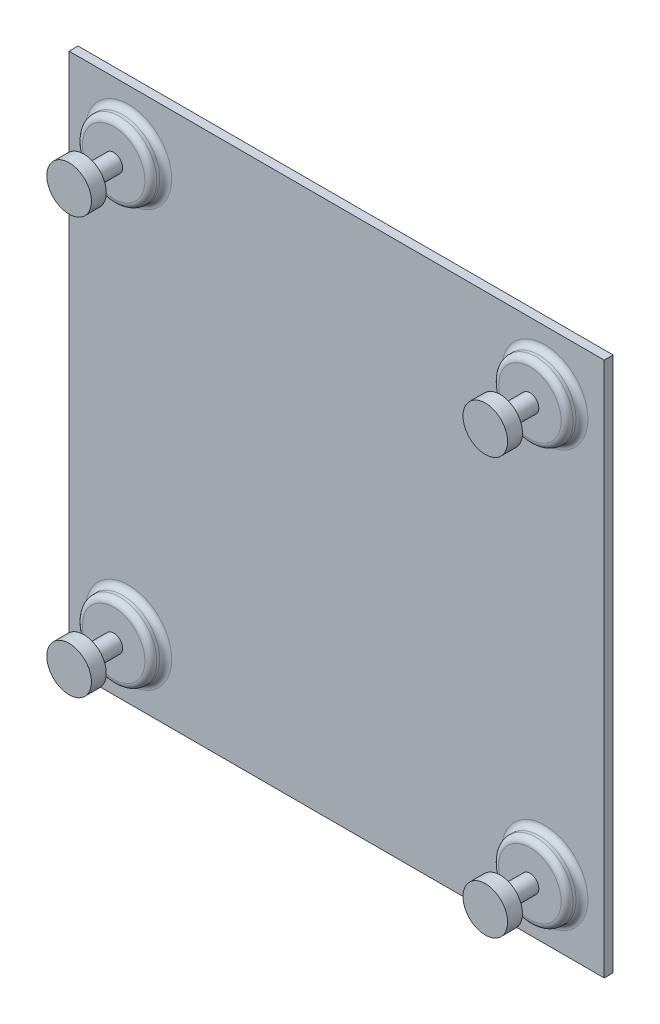
ISO-10303-21;
HEADER;
FILE_DESCRIPTION(('STEP AP214'),'2;1');
FILE_NAME('part.step','',(''),(''),'','','');
FILE_SCHEMA(('AUTOMOTIVE_DESIGN { 1 0 10303 214 1 1 1 1 }'));
ENDSEC;
DATA;
#1=APPLICATION_CONTEXT('core data for automotive mechanical design processes');
#2=APPLICATION_PROTOCOL_DEFINITION('international standard','automotive_design',2000,#1);
#3=PRODUCT_CONTEXT('',#1,'mechanical');
#4=PRODUCT('Part','Part','',(#3));
#5=PRODUCT_RELATED_PRODUCT_CATEGORY('part','',(#4));
#6=PRODUCT_DEFINITION_FORMATION('','',#4);
#7=PRODUCT_DEFINITION_CONTEXT('part definition',#1,'design');
#8=PRODUCT_DEFINITION('design','',#6,#7);
#9=PRODUCT_DEFINITION_SHAPE('','',#8);
#10=(LENGTH_UNIT() NAMED_UNIT(*) SI_UNIT(.MILLI.,.METRE.));
#11=(NAMED_UNIT(*) PLANE_ANGLE_UNIT() SI_UNIT($,.RADIAN.));
#12=(NAMED_UNIT(*) SI_UNIT($,.STERADIAN.) SOLID_ANGLE_UNIT());
#13=UNCERTAINTY_MEASURE_WITH_UNIT(LENGTH_MEASURE(1.E-05),#10,'distance_accuracy_value','');
#14=(GEOMETRIC_REPRESENTATION_CONTEXT(3) GLOBAL_UNCERTAINTY_ASSIGNED_CONTEXT((#13)) GLOBAL_UNIT_ASSIGNED_CONTEXT((#10,
#11,#12)) REPRESENTATION_CONTEXT('',''));
#15=CARTESIAN_POINT('',(0.,0.,0.));
#16=DIRECTION('',(0.,0.,1.));
#17=DIRECTION('',(1.,0.,0.));
#18=AXIS2_PLACEMENT_3D('',#15,#16,#17);
#19=CARTESIAN_POINT('',(114.3,-114.3,3.81));
#20=DIRECTION('',(-1.,0.,0.));
#21=DIRECTION('',(0.,0.,1.));
#22=AXIS2_PLACEMENT_3D('',#19,#20,#21);
#23=PLANE('',#22);
#24=DIRECTION('',(0.,1.,0.));
#25=VECTOR('',#24,1.);
#26=CARTESIAN_POINT('',(114.3,-114.3,0.));
#27=LINE('',#26,#25);
#28=CARTESIAN_POINT('',(114.3,-114.3,0.));
#29=VERTEX_POINT('',#28);
#30=CARTESIAN_POINT('',(114.3,114.3,0.));
#31=VERTEX_POINT('',#30);
#32=EDGE_CURVE('E106',#29,#31,#27,.T.);
#33=ORIENTED_EDGE('',*,*,#32,.T.);
#34=DIRECTION('',(0.,0.,-1.));
#35=VECTOR('',#34,1.);
#36=CARTESIAN_POINT('',(114.3,114.3,3.81));
#37=LINE('',#36,#35);
#38=CARTESIAN_POINT('',(114.3,114.3,3.81));
#39=VERTEX_POINT('',#38);
#40=EDGE_CURVE('E97',#39,#31,#37,.T.);
#41=ORIENTED_EDGE('',*,*,#40,.F.);
#42=DIRECTION('',(0.,1.,0.));
#43=VECTOR('',#42,1.);
#44=CARTESIAN_POINT('',(114.3,-114.3,3.81));
#45=LINE('',#44,#43);
#46=CARTESIAN_POINT('',(114.3,-114.3,3.81));
#47=VERTEX_POINT('',#46);
#48=EDGE_CURVE('E91',#47,#39,#45,.T.);
#49=ORIENTED_EDGE('',*,*,#48,.F.);
#50=DIRECTION('',(0.,0.,-1.));
#51=VECTOR('',#50,1.);
#52=CARTESIAN_POINT('',(114.3,-114.3,3.81));
#53=LINE('',#52,#51);
#54=EDGE_CURVE('E102',#47,#29,#53,.T.);
#55=ORIENTED_EDGE('',*,*,#54,.T.);
#56=EDGE_LOOP('',(#33,#41,#49,#55));
#57=FACE_BOUND('',#56,.T.);
#58=ADVANCED_FACE('F38',(#57),#23,.F.);
#59=CARTESIAN_POINT('',(-114.3,114.3,3.81));
#60=DIRECTION('',(0.,-1.,0.));
#61=DIRECTION('',(0.,0.,-1.));
#62=AXIS2_PLACEMENT_3D('',#59,#60,#61);
#63=PLANE('',#62);
#64=DIRECTION('',(-1.,0.,0.));
#65=VECTOR('',#64,1.);
#66=CARTESIAN_POINT('',(-114.3,114.3,0.));
#67=LINE('',#66,#65);
#68=CARTESIAN_POINT('',(-114.3,114.3,0.));
#69=VERTEX_POINT('',#68);
#70=EDGE_CURVE('E96',#31,#69,#67,.T.);
#71=ORIENTED_EDGE('',*,*,#70,.T.);
#72=DIRECTION('',(0.,0.,-1.));
#73=VECTOR('',#72,1.);
#74=CARTESIAN_POINT('',(-114.3,114.3,3.81));
#75=LINE('',#74,#73);
#76=CARTESIAN_POINT('',(-114.3,114.3,3.81));
#77=VERTEX_POINT('',#76);
#78=EDGE_CURVE('E94',#77,#69,#75,.T.);
#79=ORIENTED_EDGE('',*,*,#78,.F.);
#80=DIRECTION('',(-1.,0.,0.));
#81=VECTOR('',#80,1.);
#82=CARTESIAN_POINT('',(-114.3,114.3,3.81));
#83=LINE('',#82,#81);
#84=EDGE_CURVE('E86',#39,#77,#83,.T.);
#85=ORIENTED_EDGE('',*,*,#84,.F.);
#86=ORIENTED_EDGE('',*,*,#40,.T.);
#87=EDGE_LOOP('',(#71,#79,#85,#86));
#88=FACE_BOUND('',#87,.T.);
#89=ADVANCED_FACE('F95',(#88),#63,.F.);
#90=CARTESIAN_POINT('',(-114.3,-114.3,3.81));
#91=DIRECTION('',(1.,0.,0.));
#92=DIRECTION('',(0.,0.,-1.));
#93=AXIS2_PLACEMENT_3D('',#90,#91,#92);
#94=PLANE('',#93);
#95=DIRECTION('',(0.,-1.,0.));
#96=VECTOR('',#95,1.);
#97=CARTESIAN_POINT('',(-114.3,-114.3,0.));
#98=LINE('',#97,#96);
#99=CARTESIAN_POINT('',(-114.3,-114.3,0.));
#100=VERTEX_POINT('',#99);
#101=EDGE_CURVE('E72',#69,#100,#98,.T.);
#102=ORIENTED_EDGE('',*,*,#101,.T.);
#103=DIRECTION('',(0.,0.,-1.));
#104=VECTOR('',#103,1.);
#105=CARTESIAN_POINT('',(-114.3,-114.3,3.81));
#106=LINE('',#105,#104);
#107=CARTESIAN_POINT('',(-114.3,-114.3,3.81));
#108=VERTEX_POINT('',#107);
#109=EDGE_CURVE('E98',#108,#100,#106,.T.);
#110=ORIENTED_EDGE('',*,*,#109,.F.);
#111=DIRECTION('',(0.,-1.,0.));
#112=VECTOR('',#111,1.);
#113=CARTESIAN_POINT('',(-114.3,-114.3,3.81));
#114=LINE('',#113,#112);
#115=EDGE_CURVE('E89',#77,#108,#114,.T.);
#116=ORIENTED_EDGE('',*,*,#115,.F.);
#117=ORIENTED_EDGE('',*,*,#78,.T.);
#118=EDGE_LOOP('',(#102,#110,#116,#117));
#119=FACE_BOUND('',#118,.T.);
#120=ADVANCED_FACE('F100',(#119),#94,.F.);
#121=CARTESIAN_POINT('',(-114.3,-114.3,3.81));
#122=DIRECTION('',(0.,1.,0.));
#123=DIRECTION('',(0.,0.,1.));
#124=AXIS2_PLACEMENT_3D('',#121,#122,#123);
#125=PLANE('',#124);
#126=DIRECTION('',(1.,0.,0.));
#127=VECTOR('',#126,1.);
#128=CARTESIAN_POINT('',(-114.3,-114.3,0.));
#129=LINE('',#128,#127);
#130=EDGE_CURVE('E78',#100,#29,#129,.T.);
#131=ORIENTED_EDGE('',*,*,#130,.T.);
#132=ORIENTED_EDGE('',*,*,#54,.F.);
#133=DIRECTION('',(1.,0.,0.));
#134=VECTOR('',#133,1.);
#135=CARTESIAN_POINT('',(-114.3,-114.3,3.81));
#136=LINE('',#135,#134);
#137=EDGE_CURVE('E55',#108,#47,#136,.T.);
#138=ORIENTED_EDGE('',*,*,#137,.F.);
#139=ORIENTED_EDGE('',*,*,#109,.T.);
#140=EDGE_LOOP('',(#131,#132,#138,#139));
#141=FACE_BOUND('',#140,.T.);
#142=ADVANCED_FACE('F276',(#141),#125,.F.);
#143=CARTESIAN_POINT('',(0.,0.,3.81));
#144=DIRECTION('',(0.,0.,-1.));
#145=DIRECTION('',(-1.,0.,0.));
#146=AXIS2_PLACEMENT_3D('',#143,#144,#145);
#147=PLANE('',#146);
#148=CARTESIAN_POINT('',(88.9,-88.9,3.81));
#149=DIRECTION('',(0.,0.,-1.));
#150=DIRECTION('',(-1.,0.,0.));
#151=AXIS2_PLACEMENT_3D('',#148,#149,#150);
#152=CIRCLE('',#151,18.415);
#153=CARTESIAN_POINT('',(70.485,-88.9,3.81));
#154=VERTEX_POINT('',#153);
#155=EDGE_CURVE('E154',#154,#154,#152,.T.);
#156=ORIENTED_EDGE('',*,*,#155,.T.);
#157=EDGE_LOOP('',(#156));
#158=FACE_BOUND('',#157,.T.);
#159=CARTESIAN_POINT('',(88.9,88.9,3.81));
#160=DIRECTION('',(0.,0.,-1.));
#161=DIRECTION('',(-1.,0.,0.));
#162=AXIS2_PLACEMENT_3D('',#159,#160,#161);
#163=CIRCLE('',#162,18.415);
#164=CARTESIAN_POINT('',(70.485,88.9,3.81));
#165=VERTEX_POINT('',#164);
#166=EDGE_CURVE('E151',#165,#165,#163,.T.);
#167=ORIENTED_EDGE('',*,*,#166,.T.);
#168=EDGE_LOOP('',(#167));
#169=FACE_BOUND('',#168,.T.);
#170=CARTESIAN_POINT('',(-88.9,88.9,3.81));
#171=DIRECTION('',(0.,0.,-1.));
#172=DIRECTION('',(-1.,0.,0.));
#173=AXIS2_PLACEMENT_3D('',#170,#171,#172);
#174=CIRCLE('',#173,18.415);
#175=CARTESIAN_POINT('',(-107.315,88.9,3.81));
#176=VERTEX_POINT('',#175);
#177=EDGE_CURVE('E148',#176,#176,#174,.T.);
#178=ORIENTED_EDGE('',*,*,#177,.T.);
#179=EDGE_LOOP('',(#178));
#180=FACE_BOUND('',#179,.T.);
#181=CARTESIAN_POINT('',(-88.9,-88.9,3.81));
#182=DIRECTION('',(0.,0.,-1.));
#183=DIRECTION('',(-1.,0.,0.));
#184=AXIS2_PLACEMENT_3D('',#181,#182,#183);
#185=CIRCLE('',#184,18.415);
#186=CARTESIAN_POINT('',(-107.315,-88.9,3.81));
#187=VERTEX_POINT('',#186);
#188=EDGE_CURVE('E145',#187,#187,#185,.T.);
#189=ORIENTED_EDGE('',*,*,#188,.T.);
#190=EDGE_LOOP('',(#189));
#191=FACE_BOUND('',#190,.T.);
#192=ORIENTED_EDGE('',*,*,#48,.T.);
#193=ORIENTED_EDGE('',*,*,#84,.T.);
#194=ORIENTED_EDGE('',*,*,#115,.T.);
#195=ORIENTED_EDGE('',*,*,#137,.T.);
#196=EDGE_LOOP('',(#192,#193,#194,#195));
#197=FACE_BOUND('',#196,.T.);
#198=ADVANCED_FACE('F87',(#158,#169,#180,#191,#197),#147,.F.);
#199=CARTESIAN_POINT('',(0.,0.,0.));
#200=DIRECTION('',(0.,0.,-1.));
#201=DIRECTION('',(-1.,0.,0.));
#202=AXIS2_PLACEMENT_3D('',#199,#200,#201);
#203=PLANE('',#202);
#204=ORIENTED_EDGE('',*,*,#32,.F.);
#205=ORIENTED_EDGE('',*,*,#130,.F.);
#206=ORIENTED_EDGE('',*,*,#101,.F.);
#207=ORIENTED_EDGE('',*,*,#70,.F.);
#208=EDGE_LOOP('',(#204,#205,#206,#207));
#209=FACE_BOUND('',#208,.T.);
#210=ADVANCED_FACE('F216',(#209),#203,.T.);
#211=CARTESIAN_POINT('',(88.9,-88.9,10.16));
#212=DIRECTION('',(0.,0.,-1.));
#213=DIRECTION('',(-1.,0.,0.));
#214=AXIS2_PLACEMENT_3D('',#211,#212,#213);
#215=CYLINDRICAL_SURFACE('',#214,15.875);
#216=CARTESIAN_POINT('',(88.9,-88.9,6.35));
#217=DIRECTION('',(0.,0.,-1.));
#218=DIRECTION('',(-1.,0.,0.));
#219=AXIS2_PLACEMENT_3D('',#216,#217,#218);
#220=CIRCLE('',#219,15.875);
#221=CARTESIAN_POINT('',(73.025,-88.9,6.35));
#222=VERTEX_POINT('',#221);
#223=EDGE_CURVE('E142',#222,#222,#220,.F.);
#224=ORIENTED_EDGE('',*,*,#223,.T.);
#225=EDGE_LOOP('',(#224));
#226=FACE_BOUND('',#225,.T.);
#227=CARTESIAN_POINT('',(88.9,-88.9,7.62));
#228=DIRECTION('',(0.,0.,1.));
#229=DIRECTION('',(1.,0.,0.));
#230=AXIS2_PLACEMENT_3D('',#227,#228,#229);
#231=CIRCLE('',#230,15.875);
#232=CARTESIAN_POINT('',(104.775,-88.9,7.62));
#233=VERTEX_POINT('',#232);
#234=EDGE_CURVE('E120',#233,#233,#231,.F.);
#235=ORIENTED_EDGE('',*,*,#234,.T.);
#236=EDGE_LOOP('',(#235));
#237=FACE_BOUND('',#236,.T.);
#238=ADVANCED_FACE('F212',(#226,#237),#215,.T.);
#239=CARTESIAN_POINT('',(88.9,-88.9,10.16));
#240=DIRECTION('',(0.,0.,1.));
#241=DIRECTION('',(1.,0.,0.));
#242=AXIS2_PLACEMENT_3D('',#239,#240,#241);
#243=PLANE('',#242);
#244=CARTESIAN_POINT('',(88.9,-88.9,10.16));
#245=DIRECTION('',(0.,0.,1.));
#246=DIRECTION('',(1.,0.,0.));
#247=AXIS2_PLACEMENT_3D('',#244,#245,#246);
#248=CIRCLE('',#247,13.335);
#249=CARTESIAN_POINT('',(102.235,-88.9,10.16));
#250=VERTEX_POINT('',#249);
#251=EDGE_CURVE('E117',#250,#250,#248,.T.);
#252=ORIENTED_EDGE('',*,*,#251,.T.);
#253=EDGE_LOOP('',(#252));
#254=FACE_BOUND('',#253,.T.);
#255=CARTESIAN_POINT('',(88.9,-88.9,10.16));
#256=DIRECTION('',(0.,0.,1.));
#257=DIRECTION('',(1.,0.,0.));
#258=AXIS2_PLACEMENT_3D('',#255,#256,#257);
#259=CIRCLE('',#258,3.81);
#260=CARTESIAN_POINT('',(92.71,-88.9,10.16));
#261=VERTEX_POINT('',#260);
#262=EDGE_CURVE('E228',#261,#261,#259,.T.);
#263=ORIENTED_EDGE('',*,*,#262,.F.);
#264=EDGE_LOOP('',(#263));
#265=FACE_BOUND('',#264,.T.);
#266=ADVANCED_FACE('F215',(#254,#265),#243,.T.);
#267=CARTESIAN_POINT('',(88.9,88.9,10.16));
#268=DIRECTION('',(0.,0.,-1.));
#269=DIRECTION('',(-1.,0.,0.));
#270=AXIS2_PLACEMENT_3D('',#267,#268,#269);
#271=CYLINDRICAL_SURFACE('',#270,15.875);
#272=CARTESIAN_POINT('',(88.9,88.9,6.35));
#273=DIRECTION('',(0.,0.,-1.));
#274=DIRECTION('',(-1.,0.,0.));
#275=AXIS2_PLACEMENT_3D('',#272,#273,#274);
#276=CIRCLE('',#275,15.875);
#277=CARTESIAN_POINT('',(73.025,88.9,6.35));
#278=VERTEX_POINT('',#277);
#279=EDGE_CURVE('E157',#278,#278,#276,.F.);
#280=ORIENTED_EDGE('',*,*,#279,.T.);
#281=EDGE_LOOP('',(#280));
#282=FACE_BOUND('',#281,.T.);
#283=CARTESIAN_POINT('',(88.9,88.9,7.62));
#284=DIRECTION('',(0.,0.,-1.));
#285=DIRECTION('',(-1.,0.,0.));
#286=AXIS2_PLACEMENT_3D('',#283,#284,#285);
#287=CIRCLE('',#286,15.875);
#288=CARTESIAN_POINT('',(73.025,88.9,7.62));
#289=VERTEX_POINT('',#288);
#290=EDGE_CURVE('E127',#289,#289,#287,.T.);
#291=ORIENTED_EDGE('',*,*,#290,.T.);
#292=EDGE_LOOP('',(#291));
#293=FACE_BOUND('',#292,.T.);
#294=ADVANCED_FACE('F224',(#282,#293),#271,.T.);
#295=CARTESIAN_POINT('',(88.9,88.9,10.16));
#296=DIRECTION('',(0.,0.,-1.));
#297=DIRECTION('',(-1.,0.,0.));
#298=AXIS2_PLACEMENT_3D('',#295,#296,#297);
#299=PLANE('',#298);
#300=CARTESIAN_POINT('',(88.9,88.9,10.16));
#301=DIRECTION('',(0.,0.,-1.));
#302=DIRECTION('',(-1.,0.,0.));
#303=AXIS2_PLACEMENT_3D('',#300,#301,#302);
#304=CIRCLE('',#303,13.335);
#305=CARTESIAN_POINT('',(75.565,88.9,10.16));
#306=VERTEX_POINT('',#305);
#307=EDGE_CURVE('E124',#306,#306,#304,.F.);
#308=ORIENTED_EDGE('',*,*,#307,.T.);
#309=EDGE_LOOP('',(#308));
#310=FACE_BOUND('',#309,.T.);
#311=CARTESIAN_POINT('',(88.9,88.9,10.16));
#312=DIRECTION('',(0.,0.,1.));
#313=DIRECTION('',(1.,0.,0.));
#314=AXIS2_PLACEMENT_3D('',#311,#312,#313);
#315=CIRCLE('',#314,3.81);
#316=CARTESIAN_POINT('',(92.71,88.9,10.16));
#317=VERTEX_POINT('',#316);
#318=EDGE_CURVE('E121',#317,#317,#315,.T.);
#319=ORIENTED_EDGE('',*,*,#318,.F.);
#320=EDGE_LOOP('',(#319));
#321=FACE_BOUND('',#320,.T.);
#322=ADVANCED_FACE('F263',(#310,#321),#299,.F.);
#323=CARTESIAN_POINT('',(-88.9,-88.9,10.16));
#324=DIRECTION('',(0.,0.,-1.));
#325=DIRECTION('',(-1.,0.,0.));
#326=AXIS2_PLACEMENT_3D('',#323,#324,#325);
#327=CYLINDRICAL_SURFACE('',#326,15.875);
#328=CARTESIAN_POINT('',(-88.9,-88.9,6.35));
#329=DIRECTION('',(0.,0.,-1.));
#330=DIRECTION('',(-1.,0.,0.));
#331=AXIS2_PLACEMENT_3D('',#328,#329,#330);
#332=CIRCLE('',#331,15.875);
#333=CARTESIAN_POINT('',(-104.775,-88.9,6.35));
#334=VERTEX_POINT('',#333);
#335=EDGE_CURVE('E11',#334,#334,#332,.F.);
#336=ORIENTED_EDGE('',*,*,#335,.T.);
#337=EDGE_LOOP('',(#336));
#338=FACE_BOUND('',#337,.T.);
#339=CARTESIAN_POINT('',(-88.9,-88.9,7.62));
#340=DIRECTION('',(0.,0.,-1.));
#341=DIRECTION('',(-1.,0.,0.));
#342=AXIS2_PLACEMENT_3D('',#339,#340,#341);
#343=CIRCLE('',#342,15.875);
#344=CARTESIAN_POINT('',(-104.775,-88.9,7.62));
#345=VERTEX_POINT('',#344);
#346=EDGE_CURVE('E139',#345,#345,#343,.T.);
#347=ORIENTED_EDGE('',*,*,#346,.T.);
#348=EDGE_LOOP('',(#347));
#349=FACE_BOUND('',#348,.T.);
#350=ADVANCED_FACE('F254',(#338,#349),#327,.T.);
#351=CARTESIAN_POINT('',(-88.9,-88.9,10.16));
#352=DIRECTION('',(0.,0.,-1.));
#353=DIRECTION('',(-1.,0.,0.));
#354=AXIS2_PLACEMENT_3D('',#351,#352,#353);
#355=PLANE('',#354);
#356=CARTESIAN_POINT('',(-88.9,-88.9,10.16));
#357=DIRECTION('',(0.,0.,-1.));
#358=DIRECTION('',(-1.,0.,0.));
#359=AXIS2_PLACEMENT_3D('',#356,#357,#358);
#360=CIRCLE('',#359,13.335);
#361=CARTESIAN_POINT('',(-102.235,-88.9,10.16));
#362=VERTEX_POINT('',#361);
#363=EDGE_CURVE('E136',#362,#362,#360,.F.);
#364=ORIENTED_EDGE('',*,*,#363,.T.);
#365=EDGE_LOOP('',(#364));
#366=FACE_BOUND('',#365,.T.);
#367=CARTESIAN_POINT('',(-88.9,-88.9,10.16));
#368=DIRECTION('',(0.,0.,1.));
#369=DIRECTION('',(1.,0.,0.));
#370=AXIS2_PLACEMENT_3D('',#367,#368,#369);
#371=CIRCLE('',#370,3.81);
#372=CARTESIAN_POINT('',(-85.09,-88.9,10.16));
#373=VERTEX_POINT('',#372);
#374=EDGE_CURVE('E116',#373,#373,#371,.T.);
#375=ORIENTED_EDGE('',*,*,#374,.F.);
#376=EDGE_LOOP('',(#375));
#377=FACE_BOUND('',#376,.T.);
#378=ADVANCED_FACE('F252',(#366,#377),#355,.F.);
#379=CARTESIAN_POINT('',(-88.9,88.9,10.16));
#380=DIRECTION('',(0.,0.,-1.));
#381=DIRECTION('',(-1.,0.,0.));
#382=AXIS2_PLACEMENT_3D('',#379,#380,#381);
#383=CYLINDRICAL_SURFACE('',#382,15.875);
#384=CARTESIAN_POINT('',(-88.9,88.9,6.35));
#385=DIRECTION('',(0.,0.,-1.));
#386=DIRECTION('',(-1.,0.,0.));
#387=AXIS2_PLACEMENT_3D('',#384,#385,#386);
#388=CIRCLE('',#387,15.875);
#389=CARTESIAN_POINT('',(-104.775,88.9,6.35));
#390=VERTEX_POINT('',#389);
#391=EDGE_CURVE('E47',#390,#390,#388,.F.);
#392=ORIENTED_EDGE('',*,*,#391,.T.);
#393=EDGE_LOOP('',(#392));
#394=FACE_BOUND('',#393,.T.);
#395=CARTESIAN_POINT('',(-88.9,88.9,7.62));
#396=DIRECTION('',(0.,0.,1.));
#397=DIRECTION('',(1.,0.,0.));
#398=AXIS2_PLACEMENT_3D('',#395,#396,#397);
#399=CIRCLE('',#398,15.875);
#400=CARTESIAN_POINT('',(-73.025,88.9,7.62));
#401=VERTEX_POINT('',#400);
#402=EDGE_CURVE('E133',#401,#401,#399,.F.);
#403=ORIENTED_EDGE('',*,*,#402,.T.);
#404=EDGE_LOOP('',(#403));
#405=FACE_BOUND('',#404,.T.);
#406=ADVANCED_FACE('F162',(#394,#405),#383,.T.);
#407=CARTESIAN_POINT('',(-88.9,88.9,10.16));
#408=DIRECTION('',(0.,0.,1.));
#409=DIRECTION('',(1.,0.,0.));
#410=AXIS2_PLACEMENT_3D('',#407,#408,#409);
#411=PLANE('',#410);
#412=CARTESIAN_POINT('',(-88.9,88.9,10.16));
#413=DIRECTION('',(0.,0.,1.));
#414=DIRECTION('',(1.,0.,0.));
#415=AXIS2_PLACEMENT_3D('',#412,#413,#414);
#416=CIRCLE('',#415,13.335);
#417=CARTESIAN_POINT('',(-75.565,88.9,10.16));
#418=VERTEX_POINT('',#417);
#419=EDGE_CURVE('E130',#418,#418,#416,.T.);
#420=ORIENTED_EDGE('',*,*,#419,.T.);
#421=EDGE_LOOP('',(#420));
#422=FACE_BOUND('',#421,.T.);
#423=CARTESIAN_POINT('',(-88.9,88.9,10.16));
#424=DIRECTION('',(0.,0.,1.));
#425=DIRECTION('',(1.,0.,0.));
#426=AXIS2_PLACEMENT_3D('',#423,#424,#425);
#427=CIRCLE('',#426,3.81);
#428=CARTESIAN_POINT('',(-85.09,88.9,10.16));
#429=VERTEX_POINT('',#428);
#430=EDGE_CURVE('E230',#429,#429,#427,.T.);
#431=ORIENTED_EDGE('',*,*,#430,.F.);
#432=EDGE_LOOP('',(#431));
#433=FACE_BOUND('',#432,.T.);
#434=ADVANCED_FACE('F261',(#422,#433),#411,.T.);
#435=CARTESIAN_POINT('',(-88.9,-88.9,22.86));
#436=DIRECTION('',(0.,0.,-1.));
#437=DIRECTION('',(-1.,0.,0.));
#438=AXIS2_PLACEMENT_3D('',#435,#436,#437);
#439=CYLINDRICAL_SURFACE('',#438,3.81);
#440=CARTESIAN_POINT('',(-88.9,-88.9,22.86));
#441=DIRECTION('',(0.,0.,1.));
#442=DIRECTION('',(1.,0.,0.));
#443=AXIS2_PLACEMENT_3D('',#440,#441,#442);
#444=CIRCLE('',#443,3.81);
#445=CARTESIAN_POINT('',(-85.09,-88.9,22.86));
#446=VERTEX_POINT('',#445);
#447=EDGE_CURVE('E109',#446,#446,#444,.T.);
#448=ORIENTED_EDGE('',*,*,#447,.F.);
#449=EDGE_LOOP('',(#448));
#450=FACE_BOUND('',#449,.T.);
#451=ORIENTED_EDGE('',*,*,#374,.T.);
#452=EDGE_LOOP('',(#451));
#453=FACE_BOUND('',#452,.T.);
#454=ADVANCED_FACE('F250',(#450,#453),#439,.T.);
#455=CARTESIAN_POINT('',(-88.9,88.9,22.86));
#456=DIRECTION('',(0.,0.,-1.));
#457=DIRECTION('',(-1.,0.,0.));
#458=AXIS2_PLACEMENT_3D('',#455,#456,#457);
#459=CYLINDRICAL_SURFACE('',#458,3.81);
#460=CARTESIAN_POINT('',(-88.9,88.9,22.86));
#461=DIRECTION('',(0.,0.,1.));
#462=DIRECTION('',(1.,0.,0.));
#463=AXIS2_PLACEMENT_3D('',#460,#461,#462);
#464=CIRCLE('',#463,3.81);
#465=CARTESIAN_POINT('',(-85.09,88.9,22.86));
#466=VERTEX_POINT('',#465);
#467=EDGE_CURVE('E241',#466,#466,#464,.T.);
#468=ORIENTED_EDGE('',*,*,#467,.F.);
#469=EDGE_LOOP('',(#468));
#470=FACE_BOUND('',#469,.T.);
#471=ORIENTED_EDGE('',*,*,#430,.T.);
#472=EDGE_LOOP('',(#471));
#473=FACE_BOUND('',#472,.T.);
#474=ADVANCED_FACE('F522',(#470,#473),#459,.T.);
#475=CARTESIAN_POINT('',(88.9,-88.9,22.86));
#476=DIRECTION('',(0.,0.,-1.));
#477=DIRECTION('',(-1.,0.,0.));
#478=AXIS2_PLACEMENT_3D('',#475,#476,#477);
#479=CYLINDRICAL_SURFACE('',#478,3.81);
#480=CARTESIAN_POINT('',(88.9,-88.9,22.86));
#481=DIRECTION('',(0.,0.,1.));
#482=DIRECTION('',(1.,0.,0.));
#483=AXIS2_PLACEMENT_3D('',#480,#481,#482);
#484=CIRCLE('',#483,3.81);
#485=CARTESIAN_POINT('',(92.71,-88.9,22.86));
#486=VERTEX_POINT('',#485);
#487=EDGE_CURVE('E239',#486,#486,#484,.T.);
#488=ORIENTED_EDGE('',*,*,#487,.F.);
#489=EDGE_LOOP('',(#488));
#490=FACE_BOUND('',#489,.T.);
#491=ORIENTED_EDGE('',*,*,#262,.T.);
#492=EDGE_LOOP('',(#491));
#493=FACE_BOUND('',#492,.T.);
#494=ADVANCED_FACE('F512',(#490,#493),#479,.T.);
#495=CARTESIAN_POINT('',(88.9,88.9,22.86));
#496=DIRECTION('',(0.,0.,-1.));
#497=DIRECTION('',(-1.,0.,0.));
#498=AXIS2_PLACEMENT_3D('',#495,#496,#497);
#499=CYLINDRICAL_SURFACE('',#498,3.81);
#500=CARTESIAN_POINT('',(88.9,88.9,22.86));
#501=DIRECTION('',(0.,0.,1.));
#502=DIRECTION('',(1.,0.,0.));
#503=AXIS2_PLACEMENT_3D('',#500,#501,#502);
#504=CIRCLE('',#503,3.81);
#505=CARTESIAN_POINT('',(92.71,88.9,22.86));
#506=VERTEX_POINT('',#505);
#507=EDGE_CURVE('E238',#506,#506,#504,.T.);
#508=ORIENTED_EDGE('',*,*,#507,.F.);
#509=EDGE_LOOP('',(#508));
#510=FACE_BOUND('',#509,.T.);
#511=ORIENTED_EDGE('',*,*,#318,.T.);
#512=EDGE_LOOP('',(#511));
#513=FACE_BOUND('',#512,.T.);
#514=ADVANCED_FACE('F502',(#510,#513),#499,.T.);
#515=CARTESIAN_POINT('',(-88.9,-88.9,29.21));
#516=DIRECTION('',(0.,0.,-1.));
#517=DIRECTION('',(-1.,0.,0.));
#518=AXIS2_PLACEMENT_3D('',#515,#516,#517);
#519=CYLINDRICAL_SURFACE('',#518,9.52500000000001);
#520=CARTESIAN_POINT('',(-88.9,-88.9,29.21));
#521=DIRECTION('',(0.,0.,1.));
#522=DIRECTION('',(1.,0.,0.));
#523=AXIS2_PLACEMENT_3D('',#520,#521,#522);
#524=CIRCLE('',#523,9.52500000000001);
#525=CARTESIAN_POINT('',(-79.375,-88.9,29.21));
#526=VERTEX_POINT('',#525);
#527=EDGE_CURVE('E670',#526,#526,#524,.T.);
#528=ORIENTED_EDGE('',*,*,#527,.F.);
#529=EDGE_LOOP('',(#528));
#530=FACE_BOUND('',#529,.T.);
#531=CARTESIAN_POINT('',(-88.9,-88.9,22.86));
#532=DIRECTION('',(0.,0.,1.));
#533=DIRECTION('',(1.,0.,0.));
#534=AXIS2_PLACEMENT_3D('',#531,#532,#533);
#535=CIRCLE('',#534,9.52500000000001);
#536=CARTESIAN_POINT('',(-79.375,-88.9,22.86));
#537=VERTEX_POINT('',#536);
#538=EDGE_CURVE('E668',#537,#537,#535,.T.);
#539=ORIENTED_EDGE('',*,*,#538,.T.);
#540=EDGE_LOOP('',(#539));
#541=FACE_BOUND('',#540,.T.);
#542=ADVANCED_FACE('F492',(#530,#541),#519,.T.);
#543=CARTESIAN_POINT('',(-88.9,-88.9,29.21));
#544=DIRECTION('',(0.,0.,1.));
#545=DIRECTION('',(1.,0.,0.));
#546=AXIS2_PLACEMENT_3D('',#543,#544,#545);
#547=PLANE('',#546);
#548=ORIENTED_EDGE('',*,*,#527,.T.);
#549=EDGE_LOOP('',(#548));
#550=FACE_BOUND('',#549,.T.);
#551=ADVANCED_FACE('F482',(#550),#547,.T.);
#552=CARTESIAN_POINT('',(-88.9,-88.9,22.86));
#553=DIRECTION('',(0.,0.,1.));
#554=DIRECTION('',(1.,0.,0.));
#555=AXIS2_PLACEMENT_3D('',#552,#553,#554);
#556=PLANE('',#555);
#557=ORIENTED_EDGE('',*,*,#447,.T.);
#558=EDGE_LOOP('',(#557));
#559=FACE_BOUND('',#558,.T.);
#560=ORIENTED_EDGE('',*,*,#538,.F.);
#561=EDGE_LOOP('',(#560));
#562=FACE_BOUND('',#561,.T.);
#563=ADVANCED_FACE('F472',(#559,#562),#556,.F.);
#564=CARTESIAN_POINT('',(-88.9,88.9,29.21));
#565=DIRECTION('',(0.,0.,-1.));
#566=DIRECTION('',(-1.,0.,0.));
#567=AXIS2_PLACEMENT_3D('',#564,#565,#566);
#568=CYLINDRICAL_SURFACE('',#567,9.52500000000001);
#569=CARTESIAN_POINT('',(-88.9,88.9,29.21));
#570=DIRECTION('',(0.,0.,1.));
#571=DIRECTION('',(1.,0.,0.));
#572=AXIS2_PLACEMENT_3D('',#569,#570,#571);
#573=CIRCLE('',#572,9.52500000000001);
#574=CARTESIAN_POINT('',(-79.375,88.9,29.21));
#575=VERTEX_POINT('',#574);
#576=EDGE_CURVE('E676',#575,#575,#573,.T.);
#577=ORIENTED_EDGE('',*,*,#576,.F.);
#578=EDGE_LOOP('',(#577));
#579=FACE_BOUND('',#578,.T.);
#580=CARTESIAN_POINT('',(-88.9,88.9,22.86));
#581=DIRECTION('',(0.,0.,1.));
#582=DIRECTION('',(1.,0.,0.));
#583=AXIS2_PLACEMENT_3D('',#580,#581,#582);
#584=CIRCLE('',#583,9.52500000000001);
#585=CARTESIAN_POINT('',(-79.375,88.9,22.86));
#586=VERTEX_POINT('',#585);
#587=EDGE_CURVE('E671',#586,#586,#584,.T.);
#588=ORIENTED_EDGE('',*,*,#587,.T.);
#589=EDGE_LOOP('',(#588));
#590=FACE_BOUND('',#589,.T.);
#591=ADVANCED_FACE('F462',(#579,#590),#568,.T.);
#592=CARTESIAN_POINT('',(-88.9,88.9,29.21));
#593=DIRECTION('',(0.,0.,1.));
#594=DIRECTION('',(1.,0.,0.));
#595=AXIS2_PLACEMENT_3D('',#592,#593,#594);
#596=PLANE('',#595);
#597=ORIENTED_EDGE('',*,*,#576,.T.);
#598=EDGE_LOOP('',(#597));
#599=FACE_BOUND('',#598,.T.);
#600=ADVANCED_FACE('F452',(#599),#596,.T.);
#601=CARTESIAN_POINT('',(-88.9,88.9,22.86));
#602=DIRECTION('',(0.,0.,1.));
#603=DIRECTION('',(1.,0.,0.));
#604=AXIS2_PLACEMENT_3D('',#601,#602,#603);
#605=PLANE('',#604);
#606=ORIENTED_EDGE('',*,*,#467,.T.);
#607=EDGE_LOOP('',(#606));
#608=FACE_BOUND('',#607,.T.);
#609=ORIENTED_EDGE('',*,*,#587,.F.);
#610=EDGE_LOOP('',(#609));
#611=FACE_BOUND('',#610,.T.);
#612=ADVANCED_FACE('F442',(#608,#611),#605,.F.);
#613=CARTESIAN_POINT('',(88.9,88.9,29.21));
#614=DIRECTION('',(0.,0.,-1.));
#615=DIRECTION('',(-1.,0.,0.));
#616=AXIS2_PLACEMENT_3D('',#613,#614,#615);
#617=CYLINDRICAL_SURFACE('',#616,9.52500000000001);
#618=CARTESIAN_POINT('',(88.9,88.9,29.21));
#619=DIRECTION('',(0.,0.,1.));
#620=DIRECTION('',(1.,0.,0.));
#621=AXIS2_PLACEMENT_3D('',#618,#619,#620);
#622=CIRCLE('',#621,9.52500000000001);
#623=CARTESIAN_POINT('',(98.425,88.9,29.21));
#624=VERTEX_POINT('',#623);
#625=EDGE_CURVE('E682',#624,#624,#622,.T.);
#626=ORIENTED_EDGE('',*,*,#625,.F.);
#627=EDGE_LOOP('',(#626));
#628=FACE_BOUND('',#627,.T.);
#629=CARTESIAN_POINT('',(88.9,88.9,22.86));
#630=DIRECTION('',(0.,0.,1.));
#631=DIRECTION('',(1.,0.,0.));
#632=AXIS2_PLACEMENT_3D('',#629,#630,#631);
#633=CIRCLE('',#632,9.52500000000001);
#634=CARTESIAN_POINT('',(98.425,88.9,22.86));
#635=VERTEX_POINT('',#634);
#636=EDGE_CURVE('E680',#635,#635,#633,.T.);
#637=ORIENTED_EDGE('',*,*,#636,.T.);
#638=EDGE_LOOP('',(#637));
#639=FACE_BOUND('',#638,.T.);
#640=ADVANCED_FACE('F432',(#628,#639),#617,.T.);
#641=CARTESIAN_POINT('',(88.9,88.9,29.21));
#642=DIRECTION('',(0.,0.,1.));
#643=DIRECTION('',(1.,0.,0.));
#644=AXIS2_PLACEMENT_3D('',#641,#642,#643);
#645=PLANE('',#644);
#646=ORIENTED_EDGE('',*,*,#625,.T.);
#647=EDGE_LOOP('',(#646));
#648=FACE_BOUND('',#647,.T.);
#649=ADVANCED_FACE('F422',(#648),#645,.T.);
#650=CARTESIAN_POINT('',(88.9,88.9,22.86));
#651=DIRECTION('',(0.,0.,1.));
#652=DIRECTION('',(1.,0.,0.));
#653=AXIS2_PLACEMENT_3D('',#650,#651,#652);
#654=PLANE('',#653);
#655=ORIENTED_EDGE('',*,*,#507,.T.);
#656=EDGE_LOOP('',(#655));
#657=FACE_BOUND('',#656,.T.);
#658=ORIENTED_EDGE('',*,*,#636,.F.);
#659=EDGE_LOOP('',(#658));
#660=FACE_BOUND('',#659,.T.);
#661=ADVANCED_FACE('F412',(#657,#660),#654,.F.);
#662=CARTESIAN_POINT('',(88.9,-88.9,29.21));
#663=DIRECTION('',(0.,0.,-1.));
#664=DIRECTION('',(-1.,0.,0.));
#665=AXIS2_PLACEMENT_3D('',#662,#663,#664);
#666=CYLINDRICAL_SURFACE('',#665,9.52500000000001);
#667=CARTESIAN_POINT('',(88.9,-88.9,29.21));
#668=DIRECTION('',(0.,0.,1.));
#669=DIRECTION('',(1.,0.,0.));
#670=AXIS2_PLACEMENT_3D('',#667,#668,#669);
#671=CIRCLE('',#670,9.52500000000001);
#672=CARTESIAN_POINT('',(98.425,-88.9,29.21));
#673=VERTEX_POINT('',#672);
#674=EDGE_CURVE('E688',#673,#673,#671,.T.);
#675=ORIENTED_EDGE('',*,*,#674,.F.);
#676=EDGE_LOOP('',(#675));
#677=FACE_BOUND('',#676,.T.);
#678=CARTESIAN_POINT('',(88.9,-88.9,22.86));
#679=DIRECTION('',(0.,0.,1.));
#680=DIRECTION('',(1.,0.,0.));
#681=AXIS2_PLACEMENT_3D('',#678,#679,#680);
#682=CIRCLE('',#681,9.52500000000001);
#683=CARTESIAN_POINT('',(98.425,-88.9,22.86));
#684=VERTEX_POINT('',#683);
#685=EDGE_CURVE('E685',#684,#684,#682,.T.);
#686=ORIENTED_EDGE('',*,*,#685,.T.);
#687=EDGE_LOOP('',(#686));
#688=FACE_BOUND('',#687,.T.);
#689=ADVANCED_FACE('F402',(#677,#688),#666,.T.);
#690=CARTESIAN_POINT('',(88.9,-88.9,29.21));
#691=DIRECTION('',(0.,0.,1.));
#692=DIRECTION('',(1.,0.,0.));
#693=AXIS2_PLACEMENT_3D('',#690,#691,#692);
#694=PLANE('',#693);
#695=ORIENTED_EDGE('',*,*,#674,.T.);
#696=EDGE_LOOP('',(#695));
#697=FACE_BOUND('',#696,.T.);
#698=ADVANCED_FACE('F393',(#697),#694,.T.);
#699=CARTESIAN_POINT('',(88.9,-88.9,22.86));
#700=DIRECTION('',(0.,0.,1.));
#701=DIRECTION('',(1.,0.,0.));
#702=AXIS2_PLACEMENT_3D('',#699,#700,#701);
#703=PLANE('',#702);
#704=ORIENTED_EDGE('',*,*,#487,.T.);
#705=EDGE_LOOP('',(#704));
#706=FACE_BOUND('',#705,.T.);
#707=ORIENTED_EDGE('',*,*,#685,.F.);
#708=EDGE_LOOP('',(#707));
#709=FACE_BOUND('',#708,.T.);
#710=ADVANCED_FACE('F191',(#706,#709),#703,.F.);
#711=CARTESIAN_POINT('',(88.9,-88.9,7.62));
#712=DIRECTION('',(0.,0.,1.));
#713=DIRECTION('',(1.,0.,0.));
#714=AXIS2_PLACEMENT_3D('',#711,#712,#713);
#715=TOROIDAL_SURFACE('',#714,13.335,2.54);
#716=ORIENTED_EDGE('',*,*,#234,.F.);
#717=EDGE_LOOP('',(#716));
#718=FACE_BOUND('',#717,.T.);
#719=ORIENTED_EDGE('',*,*,#251,.F.);
#720=EDGE_LOOP('',(#719));
#721=FACE_BOUND('',#720,.T.);
#722=ADVANCED_FACE('F187',(#718,#721),#715,.T.);
#723=CARTESIAN_POINT('',(88.9,88.9,7.62));
#724=DIRECTION('',(0.,0.,-1.));
#725=DIRECTION('',(-1.,0.,0.));
#726=AXIS2_PLACEMENT_3D('',#723,#724,#725);
#727=TOROIDAL_SURFACE('',#726,13.335,2.54);
#728=ORIENTED_EDGE('',*,*,#290,.F.);
#729=EDGE_LOOP('',(#728));
#730=FACE_BOUND('',#729,.T.);
#731=ORIENTED_EDGE('',*,*,#307,.F.);
#732=EDGE_LOOP('',(#731));
#733=FACE_BOUND('',#732,.T.);
#734=ADVANCED_FACE('F190',(#730,#733),#727,.T.);
#735=CARTESIAN_POINT('',(-88.9,88.9,7.62));
#736=DIRECTION('',(0.,0.,1.));
#737=DIRECTION('',(1.,0.,0.));
#738=AXIS2_PLACEMENT_3D('',#735,#736,#737);
#739=TOROIDAL_SURFACE('',#738,13.335,2.54);
#740=ORIENTED_EDGE('',*,*,#402,.F.);
#741=EDGE_LOOP('',(#740));
#742=FACE_BOUND('',#741,.T.);
#743=ORIENTED_EDGE('',*,*,#419,.F.);
#744=EDGE_LOOP('',(#743));
#745=FACE_BOUND('',#744,.T.);
#746=ADVANCED_FACE('F195',(#742,#745),#739,.T.);
#747=CARTESIAN_POINT('',(-88.9,-88.9,7.62));
#748=DIRECTION('',(0.,0.,-1.));
#749=DIRECTION('',(-1.,0.,0.));
#750=AXIS2_PLACEMENT_3D('',#747,#748,#749);
#751=TOROIDAL_SURFACE('',#750,13.335,2.54);
#752=ORIENTED_EDGE('',*,*,#346,.F.);
#753=EDGE_LOOP('',(#752));
#754=FACE_BOUND('',#753,.T.);
#755=ORIENTED_EDGE('',*,*,#363,.F.);
#756=EDGE_LOOP('',(#755));
#757=FACE_BOUND('',#756,.T.);
#758=ADVANCED_FACE('F199',(#754,#757),#751,.T.);
#759=CARTESIAN_POINT('',(88.9,-88.9,6.35));
#760=DIRECTION('',(0.,0.,-1.));
#761=DIRECTION('',(-1.,0.,0.));
#762=AXIS2_PLACEMENT_3D('',#759,#760,#761);
#763=TOROIDAL_SURFACE('',#762,18.415,2.54);
#764=ORIENTED_EDGE('',*,*,#155,.F.);
#765=EDGE_LOOP('',(#764));
#766=FACE_BOUND('',#765,.T.);
#767=ORIENTED_EDGE('',*,*,#223,.F.);
#768=EDGE_LOOP('',(#767));
#769=FACE_BOUND('',#768,.T.);
#770=ADVANCED_FACE('F174',(#766,#769),#763,.F.);
#771=CARTESIAN_POINT('',(88.9,88.9,6.35));
#772=DIRECTION('',(0.,0.,-1.));
#773=DIRECTION('',(-1.,0.,0.));
#774=AXIS2_PLACEMENT_3D('',#771,#772,#773);
#775=TOROIDAL_SURFACE('',#774,18.415,2.54);
#776=ORIENTED_EDGE('',*,*,#166,.F.);
#777=EDGE_LOOP('',(#776));
#778=FACE_BOUND('',#777,.T.);
#779=ORIENTED_EDGE('',*,*,#279,.F.);
#780=EDGE_LOOP('',(#779));
#781=FACE_BOUND('',#780,.T.);
#782=ADVANCED_FACE('F167',(#778,#781),#775,.F.);
#783=CARTESIAN_POINT('',(-88.9,88.9,6.35));
#784=DIRECTION('',(0.,0.,-1.));
#785=DIRECTION('',(-1.,0.,0.));
#786=AXIS2_PLACEMENT_3D('',#783,#784,#785);
#787=TOROIDAL_SURFACE('',#786,18.415,2.54);
#788=ORIENTED_EDGE('',*,*,#177,.F.);
#789=EDGE_LOOP('',(#788));
#790=FACE_BOUND('',#789,.T.);
#791=ORIENTED_EDGE('',*,*,#391,.F.);
#792=EDGE_LOOP('',(#791));
#793=FACE_BOUND('',#792,.T.);
#794=ADVANCED_FACE('F165',(#790,#793),#787,.F.);
#795=CARTESIAN_POINT('',(-88.9,-88.9,6.35));
#796=DIRECTION('',(0.,0.,-1.));
#797=DIRECTION('',(-1.,0.,0.));
#798=AXIS2_PLACEMENT_3D('',#795,#796,#797);
#799=TOROIDAL_SURFACE('',#798,18.415,2.54);
#800=ORIENTED_EDGE('',*,*,#188,.F.);
#801=EDGE_LOOP('',(#800));
#802=FACE_BOUND('',#801,.T.);
#803=ORIENTED_EDGE('',*,*,#335,.F.);
#804=EDGE_LOOP('',(#803));
#805=FACE_BOUND('',#804,.T.);
#806=ADVANCED_FACE('F40',(#802,#805),#799,.F.);
#807=CLOSED_SHELL('',(#58,#89,#120,#142,#198,#210,#238,#266,#294,#322,#350,#378,#406,#434,#454,
#474,#494,#514,#542,#551,#563,#591,#600,#612,#640,#649,#661,#689,#698,#710,#722,#734,#746,#758,
#770,#782,#794,#806));
#808=MANIFOLD_SOLID_BREP('B2',#807);
#809=ADVANCED_BREP_SHAPE_REPRESENTATION('',(#18,#808),#14);
#810=SHAPE_DEFINITION_REPRESENTATION(#9,#809);
ENDSEC;
END-ISO-10303-21;
